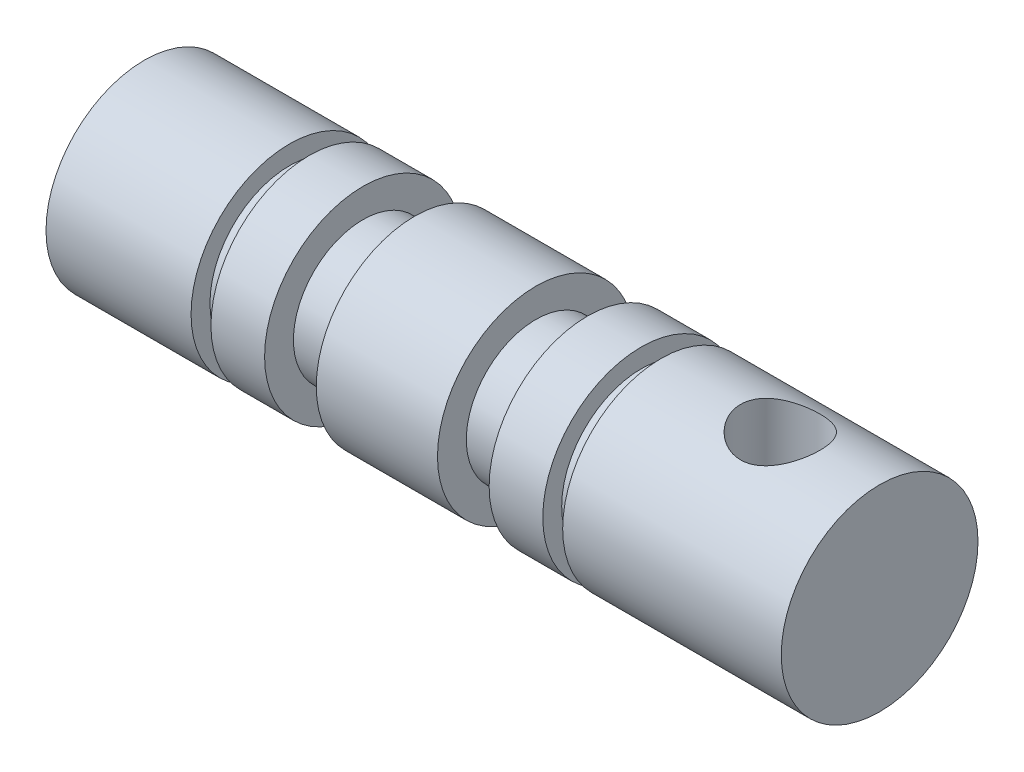
ISO-10303-21;
HEADER;
FILE_DESCRIPTION(('STEP AP214'),'2;1');
FILE_NAME('part.step','',(''),(''),'','','');
FILE_SCHEMA(('AUTOMOTIVE_DESIGN { 1 0 10303 214 1 1 1 1 }'));
ENDSEC;
DATA;
#1=APPLICATION_CONTEXT('core data for automotive mechanical design processes');
#2=APPLICATION_PROTOCOL_DEFINITION('international standard','automotive_design',2000,#1);
#3=PRODUCT_CONTEXT('',#1,'mechanical');
#4=PRODUCT('Part','Part','',(#3));
#5=PRODUCT_RELATED_PRODUCT_CATEGORY('part','',(#4));
#6=PRODUCT_DEFINITION_FORMATION('','',#4);
#7=PRODUCT_DEFINITION_CONTEXT('part definition',#1,'design');
#8=PRODUCT_DEFINITION('design','',#6,#7);
#9=PRODUCT_DEFINITION_SHAPE('','',#8);
#10=(LENGTH_UNIT() NAMED_UNIT(*) SI_UNIT(.MILLI.,.METRE.));
#11=(NAMED_UNIT(*) PLANE_ANGLE_UNIT() SI_UNIT($,.RADIAN.));
#12=(NAMED_UNIT(*) SI_UNIT($,.STERADIAN.) SOLID_ANGLE_UNIT());
#13=UNCERTAINTY_MEASURE_WITH_UNIT(LENGTH_MEASURE(1.E-05),#10,'distance_accuracy_value','');
#14=(GEOMETRIC_REPRESENTATION_CONTEXT(3) GLOBAL_UNCERTAINTY_ASSIGNED_CONTEXT((#13)) GLOBAL_UNIT_ASSIGNED_CONTEXT((#10,
#11,#12)) REPRESENTATION_CONTEXT('',''));
#15=CARTESIAN_POINT('',(0.,0.,0.));
#16=DIRECTION('',(0.,0.,1.));
#17=DIRECTION('',(1.,0.,0.));
#18=AXIS2_PLACEMENT_3D('',#15,#16,#17);
#19=CARTESIAN_POINT('',(37.,0.,0.));
#20=DIRECTION('',(-1.,0.,0.));
#21=DIRECTION('',(0.,0.,1.));
#22=AXIS2_PLACEMENT_3D('',#19,#20,#21);
#23=CYLINDRICAL_SURFACE('',#22,4.95);
#24=CARTESIAN_POINT('',(11.,0.,0.));
#25=DIRECTION('',(1.,0.,0.));
#26=DIRECTION('',(0.,0.,-1.));
#27=AXIS2_PLACEMENT_3D('',#24,#25,#26);
#28=CIRCLE('',#27,4.95);
#29=CARTESIAN_POINT('',(11.,0.,-4.95));
#30=VERTEX_POINT('',#29);
#31=EDGE_CURVE('E147',#30,#30,#28,.T.);
#32=ORIENTED_EDGE('',*,*,#31,.F.);
#33=EDGE_LOOP('',(#32));
#34=FACE_BOUND('',#33,.T.);
#35=CARTESIAN_POINT('',(8.3,0.,0.));
#36=DIRECTION('',(-1.,0.,0.));
#37=DIRECTION('',(0.,0.,1.));
#38=AXIS2_PLACEMENT_3D('',#35,#36,#37);
#39=CIRCLE('',#38,4.95);
#40=CARTESIAN_POINT('',(8.3,0.,4.95));
#41=VERTEX_POINT('',#40);
#42=EDGE_CURVE('E220',#41,#41,#39,.T.);
#43=ORIENTED_EDGE('',*,*,#42,.F.);
#44=EDGE_LOOP('',(#43));
#45=FACE_BOUND('',#44,.T.);
#46=ADVANCED_FACE('F41',(#34,#45),#23,.T.);
#47=CARTESIAN_POINT('',(13.6,0.,0.));
#48=DIRECTION('',(1.,0.,0.));
#49=DIRECTION('',(0.,0.,-1.));
#50=AXIS2_PLACEMENT_3D('',#47,#48,#49);
#51=CIRCLE('',#50,4.95);
#52=CARTESIAN_POINT('',(13.6,0.,-4.95));
#53=VERTEX_POINT('',#52);
#54=EDGE_CURVE('E150',#53,#53,#51,.T.);
#55=ORIENTED_EDGE('',*,*,#54,.T.);
#56=EDGE_LOOP('',(#55));
#57=FACE_BOUND('',#56,.T.);
#58=CARTESIAN_POINT('',(19.7,0.,0.));
#59=DIRECTION('',(1.,0.,0.));
#60=DIRECTION('',(0.,0.,-1.));
#61=AXIS2_PLACEMENT_3D('',#58,#59,#60);
#62=CIRCLE('',#61,4.95);
#63=CARTESIAN_POINT('',(19.7,0.,-4.95));
#64=VERTEX_POINT('',#63);
#65=EDGE_CURVE('E135',#64,#64,#62,.T.);
#66=ORIENTED_EDGE('',*,*,#65,.F.);
#67=EDGE_LOOP('',(#66));
#68=FACE_BOUND('',#67,.T.);
#69=ADVANCED_FACE('F170',(#57,#68),#23,.T.);
#70=CARTESIAN_POINT('',(13.6,0.,0.));
#71=DIRECTION('',(1.,0.,0.));
#72=DIRECTION('',(0.,0.,-1.));
#73=AXIS2_PLACEMENT_3D('',#70,#71,#72);
#74=PLANE('',#73);
#75=ORIENTED_EDGE('',*,*,#54,.F.);
#76=EDGE_LOOP('',(#75));
#77=FACE_BOUND('',#76,.T.);
#78=CARTESIAN_POINT('',(13.6,0.,0.));
#79=DIRECTION('',(1.,0.,0.));
#80=DIRECTION('',(0.,0.,-1.));
#81=AXIS2_PLACEMENT_3D('',#78,#79,#80);
#82=CIRCLE('',#81,3.5);
#83=CARTESIAN_POINT('',(13.6,0.,-3.5));
#84=VERTEX_POINT('',#83);
#85=EDGE_CURVE('E144',#84,#84,#82,.T.);
#86=ORIENTED_EDGE('',*,*,#85,.T.);
#87=EDGE_LOOP('',(#86));
#88=FACE_BOUND('',#87,.T.);
#89=ADVANCED_FACE('F176',(#77,#88),#74,.F.);
#90=CARTESIAN_POINT('',(11.,0.,0.));
#91=DIRECTION('',(1.,0.,0.));
#92=DIRECTION('',(0.,0.,-1.));
#93=AXIS2_PLACEMENT_3D('',#90,#91,#92);
#94=PLANE('',#93);
#95=ORIENTED_EDGE('',*,*,#31,.T.);
#96=EDGE_LOOP('',(#95));
#97=FACE_BOUND('',#96,.T.);
#98=CARTESIAN_POINT('',(11.,0.,0.));
#99=DIRECTION('',(1.,0.,0.));
#100=DIRECTION('',(0.,0.,-1.));
#101=AXIS2_PLACEMENT_3D('',#98,#99,#100);
#102=CIRCLE('',#101,3.5);
#103=CARTESIAN_POINT('',(11.,0.,-3.5));
#104=VERTEX_POINT('',#103);
#105=EDGE_CURVE('E141',#104,#104,#102,.T.);
#106=ORIENTED_EDGE('',*,*,#105,.F.);
#107=EDGE_LOOP('',(#106));
#108=FACE_BOUND('',#107,.T.);
#109=ADVANCED_FACE('F357',(#97,#108),#94,.T.);
#110=CARTESIAN_POINT('',(13.6,0.,0.));
#111=DIRECTION('',(-1.,0.,0.));
#112=DIRECTION('',(0.,0.,1.));
#113=AXIS2_PLACEMENT_3D('',#110,#111,#112);
#114=CYLINDRICAL_SURFACE('',#113,3.5);
#115=ORIENTED_EDGE('',*,*,#85,.F.);
#116=EDGE_LOOP('',(#115));
#117=FACE_BOUND('',#116,.T.);
#118=ORIENTED_EDGE('',*,*,#105,.T.);
#119=EDGE_LOOP('',(#118));
#120=FACE_BOUND('',#119,.T.);
#121=ADVANCED_FACE('F340',(#117,#120),#114,.T.);
#122=CARTESIAN_POINT('',(22.3,0.,0.));
#123=DIRECTION('',(1.,0.,0.));
#124=DIRECTION('',(0.,0.,-1.));
#125=AXIS2_PLACEMENT_3D('',#122,#123,#124);
#126=PLANE('',#125);
#127=CARTESIAN_POINT('',(22.3,0.,0.));
#128=DIRECTION('',(1.,0.,0.));
#129=DIRECTION('',(0.,0.,-1.));
#130=AXIS2_PLACEMENT_3D('',#127,#128,#129);
#131=CIRCLE('',#130,4.95);
#132=CARTESIAN_POINT('',(22.3,0.,-4.95));
#133=VERTEX_POINT('',#132);
#134=EDGE_CURVE('E138',#133,#133,#131,.T.);
#135=ORIENTED_EDGE('',*,*,#134,.F.);
#136=EDGE_LOOP('',(#135));
#137=FACE_BOUND('',#136,.T.);
#138=CARTESIAN_POINT('',(22.3,0.,0.));
#139=DIRECTION('',(1.,0.,0.));
#140=DIRECTION('',(0.,0.,-1.));
#141=AXIS2_PLACEMENT_3D('',#138,#139,#140);
#142=CIRCLE('',#141,3.5);
#143=CARTESIAN_POINT('',(22.3,0.,-3.5));
#144=VERTEX_POINT('',#143);
#145=EDGE_CURVE('E132',#144,#144,#142,.T.);
#146=ORIENTED_EDGE('',*,*,#145,.T.);
#147=EDGE_LOOP('',(#146));
#148=FACE_BOUND('',#147,.T.);
#149=ADVANCED_FACE('F329',(#137,#148),#126,.F.);
#150=CARTESIAN_POINT('',(19.7,0.,0.));
#151=DIRECTION('',(1.,0.,0.));
#152=DIRECTION('',(0.,0.,-1.));
#153=AXIS2_PLACEMENT_3D('',#150,#151,#152);
#154=PLANE('',#153);
#155=ORIENTED_EDGE('',*,*,#65,.T.);
#156=EDGE_LOOP('',(#155));
#157=FACE_BOUND('',#156,.T.);
#158=CARTESIAN_POINT('',(19.7,0.,0.));
#159=DIRECTION('',(1.,0.,0.));
#160=DIRECTION('',(0.,0.,-1.));
#161=AXIS2_PLACEMENT_3D('',#158,#159,#160);
#162=CIRCLE('',#161,3.5);
#163=CARTESIAN_POINT('',(19.7,0.,-3.5));
#164=VERTEX_POINT('',#163);
#165=EDGE_CURVE('E129',#164,#164,#162,.T.);
#166=ORIENTED_EDGE('',*,*,#165,.F.);
#167=EDGE_LOOP('',(#166));
#168=FACE_BOUND('',#167,.T.);
#169=ADVANCED_FACE('F203',(#157,#168),#154,.T.);
#170=CARTESIAN_POINT('',(22.3,0.,0.));
#171=DIRECTION('',(-1.,0.,0.));
#172=DIRECTION('',(0.,0.,1.));
#173=AXIS2_PLACEMENT_3D('',#170,#171,#172);
#174=CYLINDRICAL_SURFACE('',#173,3.5);
#175=ORIENTED_EDGE('',*,*,#145,.F.);
#176=EDGE_LOOP('',(#175));
#177=FACE_BOUND('',#176,.T.);
#178=ORIENTED_EDGE('',*,*,#165,.T.);
#179=EDGE_LOOP('',(#178));
#180=FACE_BOUND('',#179,.T.);
#181=ADVANCED_FACE('F194',(#177,#180),#174,.T.);
#182=CARTESIAN_POINT('',(25.,0.,0.));
#183=DIRECTION('',(-1.,0.,0.));
#184=DIRECTION('',(0.,0.,1.));
#185=AXIS2_PLACEMENT_3D('',#182,#183,#184);
#186=CIRCLE('',#185,4.95);
#187=CARTESIAN_POINT('',(25.,0.,4.95));
#188=VERTEX_POINT('',#187);
#189=EDGE_CURVE('E231',#188,#188,#186,.T.);
#190=ORIENTED_EDGE('',*,*,#189,.T.);
#191=EDGE_LOOP('',(#190));
#192=FACE_BOUND('',#191,.T.);
#193=ORIENTED_EDGE('',*,*,#134,.T.);
#194=EDGE_LOOP('',(#193));
#195=FACE_BOUND('',#194,.T.);
#196=ADVANCED_FACE('F43',(#192,#195),#23,.T.);
#197=CARTESIAN_POINT('',(7.3,0.,0.));
#198=DIRECTION('',(-1.,0.,0.));
#199=DIRECTION('',(0.,0.,1.));
#200=AXIS2_PLACEMENT_3D('',#197,#198,#199);
#201=PLANE('',#200);
#202=CARTESIAN_POINT('',(7.3,0.,0.));
#203=DIRECTION('',(-1.,0.,0.));
#204=DIRECTION('',(0.,0.,1.));
#205=AXIS2_PLACEMENT_3D('',#202,#203,#204);
#206=CIRCLE('',#205,4.95);
#207=CARTESIAN_POINT('',(7.3,0.,4.95));
#208=VERTEX_POINT('',#207);
#209=EDGE_CURVE('E87',#208,#208,#206,.T.);
#210=ORIENTED_EDGE('',*,*,#209,.F.);
#211=EDGE_LOOP('',(#210));
#212=FACE_BOUND('',#211,.T.);
#213=CARTESIAN_POINT('',(7.3,0.,0.));
#214=DIRECTION('',(-1.,0.,0.));
#215=DIRECTION('',(0.,0.,1.));
#216=AXIS2_PLACEMENT_3D('',#213,#214,#215);
#217=CIRCLE('',#216,4.);
#218=CARTESIAN_POINT('',(7.3,0.,4.));
#219=VERTEX_POINT('',#218);
#220=EDGE_CURVE('E223',#219,#219,#217,.T.);
#221=ORIENTED_EDGE('',*,*,#220,.T.);
#222=EDGE_LOOP('',(#221));
#223=FACE_BOUND('',#222,.T.);
#224=ADVANCED_FACE('F193',(#212,#223),#201,.F.);
#225=CARTESIAN_POINT('',(8.3,0.,0.));
#226=DIRECTION('',(-1.,0.,0.));
#227=DIRECTION('',(0.,0.,1.));
#228=AXIS2_PLACEMENT_3D('',#225,#226,#227);
#229=PLANE('',#228);
#230=ORIENTED_EDGE('',*,*,#42,.T.);
#231=EDGE_LOOP('',(#230));
#232=FACE_BOUND('',#231,.T.);
#233=CARTESIAN_POINT('',(8.3,0.,0.));
#234=DIRECTION('',(-1.,0.,0.));
#235=DIRECTION('',(0.,0.,1.));
#236=AXIS2_PLACEMENT_3D('',#233,#234,#235);
#237=CIRCLE('',#236,4.);
#238=CARTESIAN_POINT('',(8.3,0.,4.));
#239=VERTEX_POINT('',#238);
#240=EDGE_CURVE('E225',#239,#239,#237,.T.);
#241=ORIENTED_EDGE('',*,*,#240,.F.);
#242=EDGE_LOOP('',(#241));
#243=FACE_BOUND('',#242,.T.);
#244=ADVANCED_FACE('F200',(#232,#243),#229,.T.);
#245=CARTESIAN_POINT('',(7.3,0.,0.));
#246=DIRECTION('',(1.,0.,0.));
#247=DIRECTION('',(0.,0.,-1.));
#248=AXIS2_PLACEMENT_3D('',#245,#246,#247);
#249=CYLINDRICAL_SURFACE('',#248,4.);
#250=ORIENTED_EDGE('',*,*,#220,.F.);
#251=EDGE_LOOP('',(#250));
#252=FACE_BOUND('',#251,.T.);
#253=ORIENTED_EDGE('',*,*,#240,.T.);
#254=EDGE_LOOP('',(#253));
#255=FACE_BOUND('',#254,.T.);
#256=ADVANCED_FACE('F257',(#252,#255),#249,.T.);
#257=CARTESIAN_POINT('',(10.,0.,0.));
#258=DIRECTION('',(-1.,0.,0.));
#259=DIRECTION('',(0.,0.,1.));
#260=AXIS2_PLACEMENT_3D('',#257,#258,#259);
#261=PLANE('',#260);
#262=CARTESIAN_POINT('',(10.,0.,0.));
#263=DIRECTION('',(-1.,0.,0.));
#264=DIRECTION('',(0.,0.,1.));
#265=AXIS2_PLACEMENT_3D('',#262,#263,#264);
#266=CIRCLE('',#265,1.5);
#267=CARTESIAN_POINT('',(10.,0.,1.5));
#268=VERTEX_POINT('',#267);
#269=EDGE_CURVE('E126',#268,#268,#266,.T.);
#270=ORIENTED_EDGE('',*,*,#269,.T.);
#271=EDGE_LOOP('',(#270));
#272=FACE_BOUND('',#271,.T.);
#273=ADVANCED_FACE('F114',(#272),#261,.T.);
#274=CARTESIAN_POINT('',(3.3,0.,0.));
#275=DIRECTION('',(0.,1.,0.));
#276=DIRECTION('',(0.,0.,1.));
#277=AXIS2_PLACEMENT_3D('',#274,#275,#276);
#278=PLANE('',#277);
#279=CARTESIAN_POINT('',(3.3,0.,0.));
#280=DIRECTION('',(0.,1.,0.));
#281=DIRECTION('',(0.,0.,1.));
#282=AXIS2_PLACEMENT_3D('',#279,#280,#281);
#283=CIRCLE('',#282,1.6);
#284=CARTESIAN_POINT('',(2.743223563717,0.,1.5));
#285=VERTEX_POINT('',#284);
#286=CARTESIAN_POINT('',(3.856776436283,0.,1.5));
#287=VERTEX_POINT('',#286);
#288=EDGE_CURVE('E60',#285,#287,#283,.T.);
#289=ORIENTED_EDGE('',*,*,#288,.F.);
#290=DIRECTION('',(-1.,0.,0.));
#291=VECTOR('',#290,1.);
#292=CARTESIAN_POINT('',(10.,0.,1.5));
#293=LINE('',#292,#291);
#294=EDGE_CURVE('E74',#287,#285,#293,.T.);
#295=ORIENTED_EDGE('',*,*,#294,.F.);
#296=EDGE_LOOP('',(#289,#295));
#297=FACE_BOUND('',#296,.T.);
#298=ADVANCED_FACE('F75',(#297),#278,.F.);
#299=CARTESIAN_POINT('',(10.,0.,0.));
#300=DIRECTION('',(-1.,0.,0.));
#301=DIRECTION('',(0.,0.,1.));
#302=AXIS2_PLACEMENT_3D('',#299,#300,#301);
#303=CYLINDRICAL_SURFACE('',#302,1.5);
#304=CARTESIAN_POINT('',(2.743223563717,0.,1.5));
#305=CARTESIAN_POINT('',(2.74343305549233,-0.0400406506989848,1.50003689581477));
#306=CARTESIAN_POINT('',(2.73889316061447,-0.0796117870320099,1.49840154866974));
#307=CARTESIAN_POINT('',(2.72285021467995,-0.156251613102705,1.49231253008653));
#308=CARTESIAN_POINT('',(2.71150205489312,-0.193356151381784,1.48792145336253));
#309=CARTESIAN_POINT('',(2.67641377922563,-0.285772597585858,1.47364850090237));
#310=CARTESIAN_POINT('',(2.64929649479247,-0.339442502094465,1.46206424725791));
#311=CARTESIAN_POINT('',(2.58968248286407,-0.443103124694231,1.43407501082496));
#312=CARTESIAN_POINT('',(2.55711683425153,-0.493033017270301,1.4176058548068));
#313=CARTESIAN_POINT('',(2.4902852391322,-0.588891574228448,1.38050779178918));
#314=CARTESIAN_POINT('',(2.45605227582223,-0.634869164168335,1.35994524976092));
#315=CARTESIAN_POINT('',(2.38695516011965,-0.724183025218754,1.31455977806699));
#316=CARTESIAN_POINT('',(2.35209053936795,-0.767517222870795,1.28973356078901));
#317=CARTESIAN_POINT('',(2.24834322623198,-0.893465581013215,1.2089873917827));
#318=CARTESIAN_POINT('',(2.17992577640524,-0.9725318387014,1.14660254316257));
#319=CARTESIAN_POINT('',(2.06749766491797,-1.09984242619632,1.02273354964207));
#320=CARTESIAN_POINT('',(2.02183013802771,-1.15069622753619,0.965408801913105));
#321=CARTESIAN_POINT('',(1.93658590316892,-1.24470891321561,0.840701451392972));
#322=CARTESIAN_POINT('',(1.89700192562606,-1.28787699159181,0.77333104549858));
#323=CARTESIAN_POINT('',(1.83392848085342,-1.35628109272507,0.643960799477055));
#324=CARTESIAN_POINT('',(1.80880378643432,-1.38337936300443,0.583750361774985));
#325=CARTESIAN_POINT('',(1.76553178188983,-1.4299185685067,0.458053248421147));
#326=CARTESIAN_POINT('',(1.74737976546598,-1.4493646688771,0.39257016784509));
#327=CARTESIAN_POINT('',(1.71930975646841,-1.47939523119873,0.257326450701661));
#328=CARTESIAN_POINT('',(1.70945284105084,-1.48991396533459,0.187538076997913));
#329=CARTESIAN_POINT('',(1.69911649784795,-1.50094371499891,0.0464925763076652));
#330=CARTESIAN_POINT('',(1.69863188121701,-1.50146026809892,-0.024763716107998));
#331=CARTESIAN_POINT('',(1.70656617590471,-1.49299454618529,-0.15773657868371));
#332=CARTESIAN_POINT('',(1.71394823108093,-1.48511845910861,-0.219592423546615));
#333=CARTESIAN_POINT('',(1.73548417169899,-1.46209652873992,-0.34069662313972));
#334=CARTESIAN_POINT('',(1.74963894104922,-1.44694973654578,-0.399944636418798));
#335=CARTESIAN_POINT('',(1.78436498269606,-1.40967974581005,-0.516391426900949));
#336=CARTESIAN_POINT('',(1.80512330511915,-1.38735293676104,-0.573467934112342));
#337=CARTESIAN_POINT('',(1.85176557538089,-1.33696405306321,-0.682755352459664));
#338=CARTESIAN_POINT('',(1.87765221159281,-1.30889897003813,-0.734963690394219));
#339=CARTESIAN_POINT('',(1.94801718866405,-1.23215492747934,-0.860017096916105));
#340=CARTESIAN_POINT('',(1.99515833875834,-1.18035083181814,-0.929455419269533));
#341=CARTESIAN_POINT('',(2.09547539368455,-1.06840861810448,-1.05626386617199));
#342=CARTESIAN_POINT('',(2.14866636767601,-1.0082496031583,-1.11360279301278));
#343=CARTESIAN_POINT('',(2.25953684410487,-0.879599923548978,-1.217926520128));
#344=CARTESIAN_POINT('',(2.31729548080766,-0.810938084773342,-1.26461543106167));
#345=CARTESIAN_POINT('',(2.40358876676336,-0.702857410548888,-1.3257812716537));
#346=CARTESIAN_POINT('',(2.43228666472515,-0.665995083524647,-1.34468735279449));
#347=CARTESIAN_POINT('',(2.4889044518916,-0.590348523879942,-1.37957415045871));
#348=CARTESIAN_POINT('',(2.51682476391451,-0.551565368911397,-1.39555648420296));
#349=CARTESIAN_POINT('',(2.5701550147374,-0.472754212243339,-1.42415458770959));
#350=CARTESIAN_POINT('',(2.59561200518694,-0.43278686510067,-1.43684867580768));
#351=CARTESIAN_POINT('',(2.64319998055746,-0.350049519311362,-1.4592119584829));
#352=CARTESIAN_POINT('',(2.66533343126088,-0.307281632596669,-1.46888340142293));
#353=CARTESIAN_POINT('',(2.69803926466129,-0.230652095445099,-1.48252029573053));
#354=CARTESIAN_POINT('',(2.71011589593019,-0.197602617533523,-1.48732417134582));
#355=CARTESIAN_POINT('',(2.72917319272957,-0.129887932537238,-1.49474727336258));
#356=CARTESIAN_POINT('',(2.73617762083447,-0.095231079728732,-1.49737669512389));
#357=CARTESIAN_POINT('',(2.74214583625724,-0.0402251799588558,-1.49959822712595));
#358=CARTESIAN_POINT('',(2.74327113543149,-0.0201253517504161,-1.5000098761497));
#359=CARTESIAN_POINT('',(2.743223563717,0.,-1.5));
#360=B_SPLINE_CURVE_WITH_KNOTS('',3,(#304,#305,#306,#307,#308,#309,#310,#311,#312,#313,#314,
#315,#316,#317,#318,#319,#320,#321,#322,#323,#324,#325,#326,#327,#328,#329,#330,#331,#332,#333,
#334,#335,#336,#337,#338,#339,#340,#341,#342,#343,#344,#345,#346,#347,#348,#349,#350,#351,#352,
#353,#354,#355,#356,#357,#358,#359),.UNSPECIFIED.,.F.,.F.,(4,2,2,2,2,2,2,2,2,2,2,2,2,2,2,2,2,2,
2,2,2,2,2,2,2,2,2,4),(0.,0.119100457230796,0.235588943219049,0.418305960935853,
0.603538517644641,0.785982114290053,0.96856702543213,1.33176653653372,1.59852519002777,
1.86496255777631,2.07607788263128,2.28705046105211,2.49956317556399,2.71195823193469,
2.89946012174952,3.08698648915411,3.28038517412508,3.47388551244408,3.76812497767563,
4.06311409697746,4.36550469362875,4.51660376844251,4.66761901099857,4.81461267447055,
4.96149673657255,5.06771714004253,5.17343663810493,5.23374097753833),.UNSPECIFIED.);
#361=CARTESIAN_POINT('',(2.743223563717,0.,-1.5));
#362=VERTEX_POINT('',#361);
#363=EDGE_CURVE('E79',#285,#362,#360,.T.);
#364=ORIENTED_EDGE('',*,*,#363,.T.);
#365=DIRECTION('',(-1.,0.,0.));
#366=VECTOR('',#365,1.);
#367=CARTESIAN_POINT('',(10.,0.,-1.5));
#368=LINE('',#367,#366);
#369=CARTESIAN_POINT('',(3.856776436283,0.,-1.5));
#370=VERTEX_POINT('',#369);
#371=EDGE_CURVE('E67',#362,#370,#368,.F.);
#372=ORIENTED_EDGE('',*,*,#371,.T.);
#373=CARTESIAN_POINT('',(3.856776436283,0.,-1.5));
#374=CARTESIAN_POINT('',(3.85656694450767,-0.0400406506989848,-1.50003689581477));
#375=CARTESIAN_POINT('',(3.86110683938553,-0.0796117870320099,-1.49840154866974));
#376=CARTESIAN_POINT('',(3.87714978532005,-0.156251613102705,-1.49231253008653));
#377=CARTESIAN_POINT('',(3.88849794510688,-0.193356151381784,-1.48792145336253));
#378=CARTESIAN_POINT('',(3.92358622077437,-0.285772597585858,-1.47364850090237));
#379=CARTESIAN_POINT('',(3.95070350520753,-0.339442502094464,-1.46206424725791));
#380=CARTESIAN_POINT('',(4.01031751713592,-0.44310312469423,-1.43407501082496));
#381=CARTESIAN_POINT('',(4.04288316574847,-0.4930330172703,-1.4176058548068));
#382=CARTESIAN_POINT('',(4.1097147608678,-0.588891574228448,-1.38050779178918));
#383=CARTESIAN_POINT('',(4.14394772417777,-0.634869164168334,-1.35994524976092));
#384=CARTESIAN_POINT('',(4.21304483988034,-0.724183025218754,-1.31455977806699));
#385=CARTESIAN_POINT('',(4.24790946063205,-0.767517222870795,-1.28973356078901));
#386=CARTESIAN_POINT('',(4.35165677376802,-0.893465581013215,-1.20898739178269));
#387=CARTESIAN_POINT('',(4.42007422359476,-0.972531838701401,-1.14660254316257));
#388=CARTESIAN_POINT('',(4.53250233508203,-1.09984242619632,-1.02273354964207));
#389=CARTESIAN_POINT('',(4.57816986197229,-1.15069622753619,-0.965408801913104));
#390=CARTESIAN_POINT('',(4.66341409683108,-1.24470891321561,-0.840701451392971));
#391=CARTESIAN_POINT('',(4.70299807437394,-1.28787699159181,-0.773331045498579));
#392=CARTESIAN_POINT('',(4.76607151914658,-1.35628109272507,-0.643960799477053));
#393=CARTESIAN_POINT('',(4.79119621356568,-1.38337936300443,-0.583750361774984));
#394=CARTESIAN_POINT('',(4.83446821811017,-1.4299185685067,-0.458053248421145));
#395=CARTESIAN_POINT('',(4.85262023453402,-1.4493646688771,-0.392570167845089));
#396=CARTESIAN_POINT('',(4.88069024353159,-1.47939523119873,-0.25732645070166));
#397=CARTESIAN_POINT('',(4.89054715894916,-1.48991396533459,-0.187538076997912));
#398=CARTESIAN_POINT('',(4.90088350215205,-1.50094371499891,-0.0464925763076638));
#399=CARTESIAN_POINT('',(4.90136811878299,-1.50146026809892,0.0247637161079993));
#400=CARTESIAN_POINT('',(4.89343382409529,-1.49299454618529,0.157736578683711));
#401=CARTESIAN_POINT('',(4.88605176891907,-1.48511845910861,0.219592423546616));
#402=CARTESIAN_POINT('',(4.86451582830101,-1.46209652873992,0.340696623139721));
#403=CARTESIAN_POINT('',(4.85036105895078,-1.44694973654578,0.399944636418799));
#404=CARTESIAN_POINT('',(4.81563501730394,-1.40967974581005,0.51639142690095));
#405=CARTESIAN_POINT('',(4.79487669488085,-1.38735293676104,0.573467934112343));
#406=CARTESIAN_POINT('',(4.74823442461911,-1.33696405306321,0.682755352459665));
#407=CARTESIAN_POINT('',(4.72234778840719,-1.30889897003813,0.73496369039422));
#408=CARTESIAN_POINT('',(4.65198281133595,-1.23215492747934,0.860017096916105));
#409=CARTESIAN_POINT('',(4.60484166124166,-1.18035083181814,0.929455419269534));
#410=CARTESIAN_POINT('',(4.50452460631545,-1.06840861810448,1.05626386617199));
#411=CARTESIAN_POINT('',(4.45133363232399,-1.0082496031583,1.11360279301278));
#412=CARTESIAN_POINT('',(4.34046315589512,-0.879599923548977,1.217926520128));
#413=CARTESIAN_POINT('',(4.28270451919234,-0.810938084773341,1.26461543106167));
#414=CARTESIAN_POINT('',(4.19641123323664,-0.702857410548887,1.3257812716537));
#415=CARTESIAN_POINT('',(4.16771333527485,-0.665995083524646,1.34468735279449));
#416=CARTESIAN_POINT('',(4.1110955481084,-0.590348523879941,1.37957415045871));
#417=CARTESIAN_POINT('',(4.08317523608548,-0.551565368911396,1.39555648420296));
#418=CARTESIAN_POINT('',(4.0298449852626,-0.472754212243338,1.42415458770959));
#419=CARTESIAN_POINT('',(4.00438799481306,-0.432786865100669,1.43684867580768));
#420=CARTESIAN_POINT('',(3.95680001944254,-0.350049519311361,1.4592119584829));
#421=CARTESIAN_POINT('',(3.93466656873912,-0.307281632596668,1.46888340142294));
#422=CARTESIAN_POINT('',(3.90196073533871,-0.230652095445097,1.48252029573053));
#423=CARTESIAN_POINT('',(3.88988410406981,-0.197602617533522,1.48732417134582));
#424=CARTESIAN_POINT('',(3.87082680727043,-0.129887932537237,1.49474727336258));
#425=CARTESIAN_POINT('',(3.86382237916553,-0.0952310797287308,1.49737669512389));
#426=CARTESIAN_POINT('',(3.85785416374276,-0.0402251799588549,1.49959822712595));
#427=CARTESIAN_POINT('',(3.85672886456851,-0.0201253517504157,1.5000098761497));
#428=CARTESIAN_POINT('',(3.856776436283,0.,1.5));
#429=B_SPLINE_CURVE_WITH_KNOTS('',3,(#373,#374,#375,#376,#377,#378,#379,#380,#381,#382,#383,
#384,#385,#386,#387,#388,#389,#390,#391,#392,#393,#394,#395,#396,#397,#398,#399,#400,#401,#402,
#403,#404,#405,#406,#407,#408,#409,#410,#411,#412,#413,#414,#415,#416,#417,#418,#419,#420,#421,
#422,#423,#424,#425,#426,#427,#428),.UNSPECIFIED.,.F.,.F.,(4,2,2,2,2,2,2,2,2,2,2,2,2,2,2,2,2,2,
2,2,2,2,2,2,2,2,2,4),(0.,0.119100457230796,0.235588943219049,0.418305960935851,0.60353851764464,
0.785982114290053,0.96856702543213,1.33176653653372,1.59852519002777,1.86496255777631,
2.07607788263128,2.28705046105211,2.49956317556399,2.71195823193469,2.89946012174952,
3.08698648915411,3.28038517412508,3.47388551244408,3.76812497767563,4.06311409697746,
4.36550469362875,4.51660376844252,4.66761901099857,4.81461267447055,4.96149673657255,
5.06771714004253,5.17343663810493,5.23374097753833),.UNSPECIFIED.);
#430=EDGE_CURVE('E85',#370,#287,#429,.T.);
#431=ORIENTED_EDGE('',*,*,#430,.T.);
#432=ORIENTED_EDGE('',*,*,#294,.T.);
#433=EDGE_LOOP('',(#364,#372,#431,#432));
#434=FACE_BOUND('',#433,.T.);
#435=ORIENTED_EDGE('',*,*,#269,.F.);
#436=EDGE_LOOP('',(#435));
#437=FACE_BOUND('',#436,.T.);
#438=CARTESIAN_POINT('',(0.,0.,0.));
#439=DIRECTION('',(-1.,0.,0.));
#440=DIRECTION('',(0.,0.,1.));
#441=AXIS2_PLACEMENT_3D('',#438,#439,#440);
#442=CIRCLE('',#441,1.5);
#443=CARTESIAN_POINT('',(0.,0.,1.5));
#444=VERTEX_POINT('',#443);
#445=EDGE_CURVE('E124',#444,#444,#442,.T.);
#446=ORIENTED_EDGE('',*,*,#445,.T.);
#447=EDGE_LOOP('',(#446));
#448=FACE_BOUND('',#447,.T.);
#449=ADVANCED_FACE('F89',(#434,#437,#448),#303,.F.);
#450=EDGE_CURVE('E86',#370,#362,#283,.T.);
#451=ORIENTED_EDGE('',*,*,#450,.F.);
#452=ORIENTED_EDGE('',*,*,#371,.F.);
#453=EDGE_LOOP('',(#451,#452));
#454=FACE_BOUND('',#453,.T.);
#455=ADVANCED_FACE('F112',(#454),#278,.F.);
#456=CARTESIAN_POINT('',(0.,0.,0.));
#457=DIRECTION('',(1.,0.,0.));
#458=DIRECTION('',(0.,0.,-1.));
#459=AXIS2_PLACEMENT_3D('',#456,#457,#458);
#460=PLANE('',#459);
#461=ORIENTED_EDGE('',*,*,#445,.F.);
#462=EDGE_LOOP('',(#461));
#463=FACE_BOUND('',#462,.T.);
#464=CARTESIAN_POINT('',(0.,0.,0.));
#465=DIRECTION('',(1.,0.,0.));
#466=DIRECTION('',(0.,0.,-1.));
#467=AXIS2_PLACEMENT_3D('',#464,#465,#466);
#468=CIRCLE('',#467,4.95);
#469=CARTESIAN_POINT('',(0.,0.,-4.95));
#470=VERTEX_POINT('',#469);
#471=EDGE_CURVE('E153',#470,#470,#468,.T.);
#472=ORIENTED_EDGE('',*,*,#471,.F.);
#473=EDGE_LOOP('',(#472));
#474=FACE_BOUND('',#473,.T.);
#475=ADVANCED_FACE('F111',(#463,#474),#460,.F.);
#476=CARTESIAN_POINT('',(3.3,-4.95,0.));
#477=DIRECTION('',(0.,1.,0.));
#478=DIRECTION('',(0.,0.,1.));
#479=AXIS2_PLACEMENT_3D('',#476,#477,#478);
#480=CYLINDRICAL_SURFACE('',#479,1.6);
#481=ORIENTED_EDGE('',*,*,#450,.T.);
#482=ORIENTED_EDGE('',*,*,#363,.F.);
#483=ORIENTED_EDGE('',*,*,#288,.T.);
#484=ORIENTED_EDGE('',*,*,#430,.F.);
#485=EDGE_LOOP('',(#481,#482,#483,#484));
#486=FACE_BOUND('',#485,.T.);
#487=CARTESIAN_POINT('',(1.7,-4.95,0.));
#488=CARTESIAN_POINT('',(1.70000009423404,-4.94999988899515,0.0874492997862339));
#489=CARTESIAN_POINT('',(1.7071928963931,-4.94766099256415,0.17490032005276));
#490=CARTESIAN_POINT('',(1.73569225396372,-4.93856043807193,0.347235511990942));
#491=CARTESIAN_POINT('',(1.75700111786511,-4.93179805661219,0.432119261445816));
#492=CARTESIAN_POINT('',(1.81293220809526,-4.91458727169007,0.596810261249954));
#493=CARTESIAN_POINT('',(1.84753298407877,-4.90414480933435,0.676625450591961));
#494=CARTESIAN_POINT('',(1.92897154749387,-4.88064576902408,0.829320544859114));
#495=CARTESIAN_POINT('',(1.97581151625665,-4.86758872518254,0.902199210359787));
#496=CARTESIAN_POINT('',(2.08201419665196,-4.83976148836847,1.04134301716922));
#497=CARTESIAN_POINT('',(2.14170616725441,-4.82495206240648,1.1073489648197));
#498=CARTESIAN_POINT('',(2.27121789429781,-4.79551056487835,1.22860883453416));
#499=CARTESIAN_POINT('',(2.34103970192811,-4.78087852988387,1.28386057366138));
#500=CARTESIAN_POINT('',(2.49111836581774,-4.75302213549941,1.38348649367782));
#501=CARTESIAN_POINT('',(2.57160436834912,-4.73984589195174,1.42753022453775));
#502=CARTESIAN_POINT('',(2.73933582022022,-4.71698630495844,1.50134751377686));
#503=CARTESIAN_POINT('',(2.8265793384991,-4.70730196808934,1.5311251315609));
#504=CARTESIAN_POINT('',(3.00241268705139,-4.69293445460948,1.57460431667812));
#505=CARTESIAN_POINT('',(3.09087040070829,-4.68810134915352,1.58878920592376));
#506=CARTESIAN_POINT('',(3.26903210102533,-4.6835392117705,1.6021907680239));
#507=CARTESIAN_POINT('',(3.35873572204131,-4.68380871270739,1.60141174340361));
#508=CARTESIAN_POINT('',(3.53278267341922,-4.6892894793962,1.58528420891852));
#509=CARTESIAN_POINT('',(3.61719148123893,-4.69428956228681,1.57055828758517));
#510=CARTESIAN_POINT('',(3.78226929070075,-4.7083237734861,1.52796756750486));
#511=CARTESIAN_POINT('',(3.86293786834401,-4.71735835792454,1.50010128312424));
#512=CARTESIAN_POINT('',(4.01969349818877,-4.73859963307389,1.43159763513536));
#513=CARTESIAN_POINT('',(4.09569098233748,-4.75085298291483,1.39077040600485));
#514=CARTESIAN_POINT('',(4.23995674576105,-4.77713069841099,1.29763562104292));
#515=CARTESIAN_POINT('',(4.30822289351733,-4.79115555022336,1.24532491085544));
#516=CARTESIAN_POINT('',(4.43859725716059,-4.82023493237276,1.12768596298061));
#517=CARTESIAN_POINT('',(4.50024110995199,-4.83530627758293,1.06184625314865));
#518=CARTESIAN_POINT('',(4.61172977422158,-4.8641781273735,0.920577081336188));
#519=CARTESIAN_POINT('',(4.66157358520684,-4.87797852413313,0.845146807031062));
#520=CARTESIAN_POINT('',(4.74839168219556,-4.90291635169877,0.685897206294578));
#521=CARTESIAN_POINT('',(4.78524829068526,-4.91402916009717,0.602009607059997));
#522=CARTESIAN_POINT('',(4.84418575015886,-4.93216150504601,0.42878105860646));
#523=CARTESIAN_POINT('',(4.86627141475683,-4.93918237499767,0.339441896331597));
#524=CARTESIAN_POINT('',(4.89423299553431,-4.94812199788817,0.161782542772179));
#525=CARTESIAN_POINT('',(4.90073694791544,-4.95023831237628,0.0735709993509011));
#526=CARTESIAN_POINT('',(4.89913050453356,-4.94971884478392,-0.1026963765522));
#527=CARTESIAN_POINT('',(4.89102241054847,-4.94708381116451,-0.190752231371869));
#528=CARTESIAN_POINT('',(4.86092267153919,-4.93748787299665,-0.361739935932434));
#529=CARTESIAN_POINT('',(4.83931070916618,-4.93064534969521,-0.444745912656705));
#530=CARTESIAN_POINT('',(4.78328579253274,-4.91344372008337,-0.605925486323164));
#531=CARTESIAN_POINT('',(4.74887122782295,-4.90308417137793,-0.684098473876546));
#532=CARTESIAN_POINT('',(4.66724491678145,-4.8795795445054,-0.835603658852575));
#533=CARTESIAN_POINT('',(4.61973035830842,-4.86637040428016,-0.908762492735307));
#534=CARTESIAN_POINT('',(4.51361221088809,-4.83867078963813,-1.04627597991562));
#535=CARTESIAN_POINT('',(4.45500541844293,-4.82417994570388,-1.11062808050617));
#536=CARTESIAN_POINT('',(4.32541188034777,-4.79477079198145,-1.23154908365162));
#537=CARTESIAN_POINT('',(4.25400429798871,-4.77986054858192,-1.28766998312078));
#538=CARTESIAN_POINT('',(4.10246261321873,-4.75193760343371,-1.38718029116517));
#539=CARTESIAN_POINT('',(4.02232855080213,-4.73892489298908,-1.43056975808644));
#540=CARTESIAN_POINT('',(3.85567931630188,-4.71640714612487,-1.50314733605064));
#541=CARTESIAN_POINT('',(3.76918426529081,-4.70689157565403,-1.53237818156188));
#542=CARTESIAN_POINT('',(3.59212485943835,-4.69255476807122,-1.57574157526643));
#543=CARTESIAN_POINT('',(3.50156221153037,-4.6877315807427,-1.58988039614258));
#544=CARTESIAN_POINT('',(3.32364847972451,-4.68353839672044,-1.60218780031849));
#545=CARTESIAN_POINT('',(3.2363538848573,-4.68391596155922,-1.60109564416246));
#546=CARTESIAN_POINT('',(3.06325946456068,-4.68946294574716,-1.58477438775107));
#547=CARTESIAN_POINT('',(2.97745956021011,-4.69463211130897,-1.5695460362199));
#548=CARTESIAN_POINT('',(2.81121374368301,-4.70899747890114,-1.52589431470703));
#549=CARTESIAN_POINT('',(2.73070215907393,-4.71812466708559,-1.49769659503526));
#550=CARTESIAN_POINT('',(2.57548961426931,-4.73935595557469,-1.42908666893327));
#551=CARTESIAN_POINT('',(2.50078989727008,-4.75146069050408,-1.38867185817065));
#552=CARTESIAN_POINT('',(2.35596782094095,-4.77790889742563,-1.29481814848352));
#553=CARTESIAN_POINT('',(2.28616350541291,-4.79232436451648,-1.2409088643399));
#554=CARTESIAN_POINT('',(2.15635294173149,-4.82145404338514,-1.12240760215851));
#555=CARTESIAN_POINT('',(2.09634939779207,-4.8361683363596,-1.05781268561957));
#556=CARTESIAN_POINT('',(1.98568500601157,-4.86487010358637,-0.916993373875944));
#557=CARTESIAN_POINT('',(1.93543565887828,-4.8788126824303,-0.840435364396552));
#558=CARTESIAN_POINT('',(1.84858077044439,-4.90381290981091,-0.67951086284844));
#559=CARTESIAN_POINT('',(1.81197080231358,-4.91487149403376,-0.595146915411115));
#560=CARTESIAN_POINT('',(1.75552865090986,-4.93226293365768,-0.426604127088887));
#561=CARTESIAN_POINT('',(1.73476871446398,-4.93885401533872,-0.342762455439772));
#562=CARTESIAN_POINT('',(1.70700597848167,-4.94772209026629,-0.172614020316676));
#563=CARTESIAN_POINT('',(1.69999990699597,-4.95000010955593,-0.0863078480880893));
#564=CARTESIAN_POINT('',(1.7,-4.95,0.));
#565=B_SPLINE_CURVE_WITH_KNOTS('',3,(#487,#488,#489,#490,#491,#492,#493,#494,#495,#496,#497,
#498,#499,#500,#501,#502,#503,#504,#505,#506,#507,#508,#509,#510,#511,#512,#513,#514,#515,#516,
#517,#518,#519,#520,#521,#522,#523,#524,#525,#526,#527,#528,#529,#530,#531,#532,#533,#534,#535,
#536,#537,#538,#539,#540,#541,#542,#543,#544,#545,#546,#547,#548,#549,#550,#551,#552,#553,#554,
#555,#556,#557,#558,#559,#560,#561,#562,#563,#564),.UNSPECIFIED.,.T.,.F.,(4,2,2,2,2,2,2,2,2,2,2,
2,2,2,2,2,2,2,2,2,2,2,2,2,2,2,2,2,2,2,2,2,2,2,2,2,2,2,4),(0.,0.262030472542237,0.52410380718502,
0.785755975432299,1.04745480850507,1.31688986572874,1.58637955716539,1.86307691482642,
2.13969549176393,2.4074743648744,2.67517624555395,2.93146461153105,3.18778196011248,
3.44804228570729,3.70837419092721,3.98143635738702,4.25452166774771,4.53002136679588,
4.80543124109998,5.06953855040415,5.33360425956389,5.59056018333228,5.8475484407228,
6.11106342367077,6.37465462763996,6.64946796558942,6.92428004409546,7.19825741682423,
7.47212087222381,7.73274017523739,7.99334567532615,8.24957916434207,8.50586731353195,
8.77277790582501,9.03976201972793,9.31630669479788,9.59276153549677,9.85143333992225,
10.1100436006551),.UNSPECIFIED.);
#566=CARTESIAN_POINT('',(1.7,-4.95,0.));
#567=VERTEX_POINT('',#566);
#568=EDGE_CURVE('E118',#567,#567,#565,.T.);
#569=ORIENTED_EDGE('',*,*,#568,.F.);
#570=EDGE_LOOP('',(#569));
#571=FACE_BOUND('',#570,.T.);
#572=ADVANCED_FACE('F83',(#486,#571),#480,.F.);
#573=ORIENTED_EDGE('',*,*,#209,.T.);
#574=EDGE_LOOP('',(#573));
#575=FACE_BOUND('',#574,.T.);
#576=ORIENTED_EDGE('',*,*,#568,.T.);
#577=EDGE_LOOP('',(#576));
#578=FACE_BOUND('',#577,.T.);
#579=ORIENTED_EDGE('',*,*,#471,.T.);
#580=EDGE_LOOP('',(#579));
#581=FACE_BOUND('',#580,.T.);
#582=ADVANCED_FACE('F110',(#575,#578,#581),#23,.T.);
#583=CARTESIAN_POINT('',(26.,0.,0.));
#584=DIRECTION('',(-1.,0.,0.));
#585=DIRECTION('',(0.,0.,1.));
#586=AXIS2_PLACEMENT_3D('',#583,#584,#585);
#587=PLANE('',#586);
#588=CARTESIAN_POINT('',(26.,0.,0.));
#589=DIRECTION('',(-1.,0.,0.));
#590=DIRECTION('',(0.,0.,1.));
#591=AXIS2_PLACEMENT_3D('',#588,#589,#590);
#592=CIRCLE('',#591,4.);
#593=CARTESIAN_POINT('',(26.,0.,4.));
#594=VERTEX_POINT('',#593);
#595=EDGE_CURVE('E233',#594,#594,#592,.T.);
#596=ORIENTED_EDGE('',*,*,#595,.F.);
#597=EDGE_LOOP('',(#596));
#598=FACE_BOUND('',#597,.T.);
#599=CARTESIAN_POINT('',(26.,0.,0.));
#600=DIRECTION('',(-1.,0.,0.));
#601=DIRECTION('',(0.,0.,1.));
#602=AXIS2_PLACEMENT_3D('',#599,#600,#601);
#603=CIRCLE('',#602,4.95);
#604=CARTESIAN_POINT('',(26.,0.,4.95));
#605=VERTEX_POINT('',#604);
#606=EDGE_CURVE('E228',#605,#605,#603,.T.);
#607=ORIENTED_EDGE('',*,*,#606,.T.);
#608=EDGE_LOOP('',(#607));
#609=FACE_BOUND('',#608,.T.);
#610=ADVANCED_FACE('F208',(#598,#609),#587,.T.);
#611=CARTESIAN_POINT('',(25.,0.,0.));
#612=DIRECTION('',(-1.,0.,0.));
#613=DIRECTION('',(0.,0.,1.));
#614=AXIS2_PLACEMENT_3D('',#611,#612,#613);
#615=PLANE('',#614);
#616=CARTESIAN_POINT('',(25.,0.,0.));
#617=DIRECTION('',(-1.,0.,0.));
#618=DIRECTION('',(0.,0.,1.));
#619=AXIS2_PLACEMENT_3D('',#616,#617,#618);
#620=CIRCLE('',#619,4.);
#621=CARTESIAN_POINT('',(25.,0.,4.));
#622=VERTEX_POINT('',#621);
#623=EDGE_CURVE('E236',#622,#622,#620,.T.);
#624=ORIENTED_EDGE('',*,*,#623,.T.);
#625=EDGE_LOOP('',(#624));
#626=FACE_BOUND('',#625,.T.);
#627=ORIENTED_EDGE('',*,*,#189,.F.);
#628=EDGE_LOOP('',(#627));
#629=FACE_BOUND('',#628,.T.);
#630=ADVANCED_FACE('F213',(#626,#629),#615,.F.);
#631=CARTESIAN_POINT('',(26.,0.,0.));
#632=DIRECTION('',(-1.,0.,0.));
#633=DIRECTION('',(0.,0.,1.));
#634=AXIS2_PLACEMENT_3D('',#631,#632,#633);
#635=CYLINDRICAL_SURFACE('',#634,4.);
#636=ORIENTED_EDGE('',*,*,#595,.T.);
#637=EDGE_LOOP('',(#636));
#638=FACE_BOUND('',#637,.T.);
#639=ORIENTED_EDGE('',*,*,#623,.F.);
#640=EDGE_LOOP('',(#639));
#641=FACE_BOUND('',#640,.T.);
#642=ADVANCED_FACE('F189',(#638,#641),#635,.T.);
#643=CARTESIAN_POINT('',(37.,0.,0.));
#644=DIRECTION('',(1.,0.,0.));
#645=DIRECTION('',(0.,0.,-1.));
#646=AXIS2_PLACEMENT_3D('',#643,#644,#645);
#647=PLANE('',#646);
#648=CARTESIAN_POINT('',(37.,0.,0.));
#649=DIRECTION('',(1.,0.,0.));
#650=DIRECTION('',(0.,0.,-1.));
#651=AXIS2_PLACEMENT_3D('',#648,#649,#650);
#652=CIRCLE('',#651,4.95);
#653=CARTESIAN_POINT('',(37.,0.,-4.95));
#654=VERTEX_POINT('',#653);
#655=EDGE_CURVE('E80',#654,#654,#652,.T.);
#656=ORIENTED_EDGE('',*,*,#655,.T.);
#657=EDGE_LOOP('',(#656));
#658=FACE_BOUND('',#657,.T.);
#659=ADVANCED_FACE('F182',(#658),#647,.T.);
#660=CARTESIAN_POINT('',(30.,-4.95,0.));
#661=CARTESIAN_POINT('',(30.0000103189786,-4.94999233604355,0.107406627602987));
#662=CARTESIAN_POINT('',(30.0087037074654,-4.94646329977569,0.214995637651015));
#663=CARTESIAN_POINT('',(30.0431744688571,-4.93268980192275,0.427137002221819));
#664=CARTESIAN_POINT('',(30.0689978503209,-4.92242725596453,0.531680385091014));
#665=CARTESIAN_POINT('',(30.1366317725825,-4.89629193378388,0.734318670332697));
#666=CARTESIAN_POINT('',(30.1783895284861,-4.88043769384045,0.832433623679295));
#667=CARTESIAN_POINT('',(30.2764953866712,-4.84467623668995,1.0201750853979));
#668=CARTESIAN_POINT('',(30.3328385796194,-4.82477038370209,1.10980443611427));
#669=CARTESIAN_POINT('',(30.4613652690259,-4.78184830349163,1.28245225731779));
#670=CARTESIAN_POINT('',(30.5341328066665,-4.75873424004195,1.36501143779442));
#671=CARTESIAN_POINT('',(30.6922094048133,-4.71244190301418,1.51714443579326));
#672=CARTESIAN_POINT('',(30.7775246730812,-4.6892636032575,1.58671178695308));
#673=CARTESIAN_POINT('',(30.9629990244304,-4.64428976358368,1.7140141041459));
#674=CARTESIAN_POINT('',(31.0636576904566,-4.62260552610761,1.77106458461637));
#675=CARTESIAN_POINT('',(31.2741486633164,-4.58461379836026,1.86721966727296));
#676=CARTESIAN_POINT('',(31.3839764940183,-4.5683037035966,1.90633296603928));
#677=CARTESIAN_POINT('',(31.6044080550726,-4.54395934215866,1.96363645335955));
#678=CARTESIAN_POINT('',(31.714743218362,-4.53557860081562,1.98270710512994));
#679=CARTESIAN_POINT('',(31.9373413551166,-4.52703940492109,2.00213352782658));
#680=CARTESIAN_POINT('',(32.0496033250992,-4.52687679300191,2.00249876140637));
#681=CARTESIAN_POINT('',(32.2643350280125,-4.53449722194656,1.98517024207717));
#682=CARTESIAN_POINT('',(32.3669324632542,-4.54171484609883,1.96876159798038));
#683=CARTESIAN_POINT('',(32.5677696215306,-4.56233194707518,1.92049694501179));
#684=CARTESIAN_POINT('',(32.666008563524,-4.57573252701842,1.88863817958698));
#685=CARTESIAN_POINT('',(32.8577376378542,-4.60750209177446,1.80976718118729));
#686=CARTESIAN_POINT('',(32.9510879941735,-4.62596787047355,1.76245589449368));
#687=CARTESIAN_POINT('',(33.1288725996055,-4.66576157352171,1.65423313656141));
#688=CARTESIAN_POINT('',(33.2133034399515,-4.68709058509069,1.59331649326848));
#689=CARTESIAN_POINT('',(33.377872932833,-4.73225959147319,1.45395632390442));
#690=CARTESIAN_POINT('',(33.4571453160678,-4.75616482724401,1.37450824123685));
#691=CARTESIAN_POINT('',(33.601521902517,-4.80236252538582,1.20319516424393));
#692=CARTESIAN_POINT('',(33.6666231688391,-4.82465465281044,1.1113276024272));
#693=CARTESIAN_POINT('',(33.7819778140353,-4.86569349716381,0.915284411749027));
#694=CARTESIAN_POINT('',(33.8318989769935,-4.88435804387792,0.810894843129023));
#695=CARTESIAN_POINT('',(33.913172132141,-4.9154153018475,0.594253691733624));
#696=CARTESIAN_POINT('',(33.9445337555592,-4.92781126561487,0.482006220593889));
#697=CARTESIAN_POINT('',(33.9860310314579,-4.94433834001142,0.260091551081214));
#698=CARTESIAN_POINT('',(33.9973304574328,-4.94892192611177,0.150675575210627));
#699=CARTESIAN_POINT('',(34.0018268895317,-4.95073763811937,-0.0685749154200751));
#700=CARTESIAN_POINT('',(33.9950287061841,-4.94797171760049,-0.178409311210164));
#701=CARTESIAN_POINT('',(33.9643733477035,-4.93569477716607,-0.390062194936813));
#702=CARTESIAN_POINT('',(33.9413160264162,-4.92650018344865,-0.492016915643238));
#703=CARTESIAN_POINT('',(33.8798911776559,-4.90262106405841,-0.690512367201782));
#704=CARTESIAN_POINT('',(33.8415216903402,-4.8879358356406,-0.787052403210035));
#705=CARTESIAN_POINT('',(33.7493082540779,-4.85393555735365,-0.975318321652429));
#706=CARTESIAN_POINT('',(33.6950250341367,-4.83449210810239,-1.06680512022576));
#707=CARTESIAN_POINT('',(33.5730111725909,-4.79307563518119,-1.23969425308367));
#708=CARTESIAN_POINT('',(33.505275082537,-4.77110158813215,-1.32109247970542));
#709=CARTESIAN_POINT('',(33.3529322830141,-4.72517809149261,-1.47724645137449));
#710=CARTESIAN_POINT('',(33.2674967051096,-4.7011952586594,-1.55118586323042));
#711=CARTESIAN_POINT('',(33.0850157467851,-4.65531663651776,-1.68388525870917));
#712=CARTESIAN_POINT('',(32.9879682933784,-4.63342122111869,-1.74264252603696));
#713=CARTESIAN_POINT('',(32.7834304487867,-4.59413819913653,-1.84374113893522));
#714=CARTESIAN_POINT('',(32.6758392092091,-4.57680146378345,-1.88589964225983));
#715=CARTESIAN_POINT('',(32.4541706481163,-4.54936543186463,-1.95116665317172));
#716=CARTESIAN_POINT('',(32.3400983168982,-4.53926064623622,-1.97428961077922));
#717=CARTESIAN_POINT('',(32.1177027919925,-4.52823691905418,-1.99943528198434));
#718=CARTESIAN_POINT('',(32.0095699212333,-4.52669976482684,-2.00287852648207));
#719=CARTESIAN_POINT('',(31.7943411168077,-4.53136023054596,-1.99231222242793));
#720=CARTESIAN_POINT('',(31.6872450472377,-4.53755682253368,-1.97830499336907));
#721=CARTESIAN_POINT('',(31.4816535697205,-4.55643643661306,-1.93440366454191));
#722=CARTESIAN_POINT('',(31.3829855966475,-4.56884192202449,-1.90518733818164));
#723=CARTESIAN_POINT('',(31.1919163222163,-4.59854072165852,-1.83233797449496));
#724=CARTESIAN_POINT('',(31.0995167676954,-4.61583539148203,-1.78870093823907));
#725=CARTESIAN_POINT('',(30.9177680149639,-4.65460868430972,-1.68532773587207));
#726=CARTESIAN_POINT('',(30.8289063046423,-4.67627175542193,-1.62480482759409));
#727=CARTESIAN_POINT('',(30.6621547658869,-4.72079026121782,-1.49051625578168));
#728=CARTESIAN_POINT('',(30.5842683798055,-4.74364606692994,-1.41674645385557));
#729=CARTESIAN_POINT('',(30.436342504016,-4.78980756252758,-1.25220294034441));
#730=CARTESIAN_POINT('',(30.3671732714665,-4.81304152523918,-1.16062311988718));
#731=CARTESIAN_POINT('',(30.2451601457678,-4.85578905919506,-0.966279585133015));
#732=CARTESIAN_POINT('',(30.1923237978613,-4.87530090935975,-0.863510731434476));
#733=CARTESIAN_POINT('',(30.1056951266128,-4.90808620565632,-0.651527300896842));
#734=CARTESIAN_POINT('',(30.0715740314695,-4.92146662174804,-0.542463882309376));
#735=CARTESIAN_POINT('',(30.0224469015131,-4.94092013756402,-0.31970079765346));
#736=CARTESIAN_POINT('',(30.0073803959066,-4.94701635069126,-0.206016986191494));
#737=CARTESIAN_POINT('',(30.0007031272302,-4.94971683888932,-0.0613690952157246));
#738=CARTESIAN_POINT('',(29.999997051299,-4.95000219001481,-0.030691993917366));
#739=CARTESIAN_POINT('',(30.,-4.95,0.));
#740=B_SPLINE_CURVE_WITH_KNOTS('',3,(#660,#661,#662,#663,#664,#665,#666,#667,#668,#669,#670,
#671,#672,#673,#674,#675,#676,#677,#678,#679,#680,#681,#682,#683,#684,#685,#686,#687,#688,#689,
#690,#691,#692,#693,#694,#695,#696,#697,#698,#699,#700,#701,#702,#703,#704,#705,#706,#707,#708,
#709,#710,#711,#712,#713,#714,#715,#716,#717,#718,#719,#720,#721,#722,#723,#724,#725,#726,#727,
#728,#729,#730,#731,#732,#733,#734,#735,#736,#737,#738,#739),.UNSPECIFIED.,.T.,.F.,(4,2,2,2,2,2,
2,2,2,2,2,2,2,2,2,2,2,2,2,2,2,2,2,2,2,2,2,2,2,2,2,2,2,2,2,2,2,2,2,4),(0.,0.322136574863646,
0.645141881863481,0.967086348137382,1.28892259123983,1.62480592220241,1.96085598782388,
2.31223498761223,2.66344344585393,2.99848082785429,3.33334872024659,3.64435243728764,
3.95541166287732,4.27288796555438,4.59048516237764,4.93317710515293,5.27594000162342,
5.62573883919041,5.97535599371325,6.30393369203296,6.63242405978444,6.94578984165847,
7.25919574487888,7.5822319988056,7.90539935107528,8.25032721287925,8.59531674436998,
8.94400673540101,9.2924317886291,9.61535426402201,9.93823382158147,10.2478210128114,
10.5574941261397,10.8851223218675,11.2128530488121,11.562449905831,11.9122080242999,
12.2556072439337,12.5979139098624,12.6899660859425),.UNSPECIFIED.);
#741=CARTESIAN_POINT('',(30.,-4.95,0.));
#742=VERTEX_POINT('',#741);
#743=EDGE_CURVE('E11',#742,#742,#740,.T.);
#744=ORIENTED_EDGE('',*,*,#743,.T.);
#745=EDGE_LOOP('',(#744));
#746=FACE_BOUND('',#745,.T.);
#747=CARTESIAN_POINT('',(32.,4.52796863946737,2.));
#748=CARTESIAN_POINT('',(31.8929993635273,4.52797850299807,1.99998955050179));
#749=CARTESIAN_POINT('',(31.785811186758,4.53181632402471,1.99135893416261));
#750=CARTESIAN_POINT('',(31.5745086927977,4.54668521777635,1.95716099490057));
#751=CARTESIAN_POINT('',(31.4704037942988,4.55773634593205,1.93154644775856));
#752=CARTESIAN_POINT('',(31.2686972651852,4.58555988831872,1.86452179116675));
#753=CARTESIAN_POINT('',(31.1710719318632,4.60230989959138,1.82317345877416));
#754=CARTESIAN_POINT('',(30.9841744180042,4.63961176492328,1.72603546221795));
#755=CARTESIAN_POINT('',(30.8948999226277,4.66016256068027,1.67024981630238));
#756=CARTESIAN_POINT('',(30.7219637701977,4.70409498102005,1.54233354949959));
#757=CARTESIAN_POINT('',(30.6388499252595,4.72756889326636,1.46949365163204));
#758=CARTESIAN_POINT('',(30.4856152981173,4.77394152584002,1.31102783757063));
#759=CARTESIAN_POINT('',(30.415499354173,4.79684002924997,1.22539718155437));
#760=CARTESIAN_POINT('',(30.2875166728053,4.84059205205286,1.03953459499469));
#761=CARTESIAN_POINT('',(30.2302584933106,4.86132574322865,0.938852857912559));
#762=CARTESIAN_POINT('',(30.1337263640057,4.8972912760041,0.728298573272084));
#763=CARTESIAN_POINT('',(30.0944448815006,4.91252542148771,0.618429898142599));
#764=CARTESIAN_POINT('',(30.0369425900021,4.93512207195966,0.398364154854066));
#765=CARTESIAN_POINT('',(30.0177792415138,4.94283551919144,0.288450130394104));
#766=CARTESIAN_POINT('',(29.9980196448002,4.95079164779122,0.0667139079040463));
#767=CARTESIAN_POINT('',(29.9974163371768,4.95103716961909,-0.0451075484327313));
#768=CARTESIAN_POINT('',(30.01428268245,4.94424167720509,-0.260661560231268));
#769=CARTESIAN_POINT('',(30.0307189096606,4.93761730516359,-0.364490513137605));
#770=CARTESIAN_POINT('',(30.0794366924418,4.91839047898032,-0.567770480712633));
#771=CARTESIAN_POINT('',(30.1117194116655,4.90578758582104,-0.667221173288721));
#772=CARTESIAN_POINT('',(30.1916077692519,4.87559216155223,-0.860722765677504));
#773=CARTESIAN_POINT('',(30.2394378363426,4.8579270276897,-0.954669210633643));
#774=CARTESIAN_POINT('',(30.348850682259,4.81935436923965,-1.13344591402929));
#775=CARTESIAN_POINT('',(30.410438213596,4.79844572494705,-1.21827300715587));
#776=CARTESIAN_POINT('',(30.5504117672985,4.75385321327816,-1.38242220763814));
#777=CARTESIAN_POINT('',(30.6296453045602,4.73007726081099,-1.46099768176602));
#778=CARTESIAN_POINT('',(30.8002483705138,4.68350051440728,-1.60405590369797));
#779=CARTESIAN_POINT('',(30.8916220197341,4.66070005505628,-1.66853384685152));
#780=CARTESIAN_POINT('',(31.087316363329,4.61802203346864,-1.78332365666197));
#781=CARTESIAN_POINT('',(31.1919381316943,4.59824978088192,-1.83316470421032));
#782=CARTESIAN_POINT('',(31.4091014816839,4.56510605118307,-1.91422236720539));
#783=CARTESIAN_POINT('',(31.5216377395178,4.5517303177185,-1.94545137083921));
#784=CARTESIAN_POINT('',(31.743978648167,4.53393248523467,-1.98656248179201));
#785=CARTESIAN_POINT('',(31.853519780322,4.52900648945411,-1.99764850211657));
#786=CARTESIAN_POINT('',(32.0729840766652,4.52722902393664,-2.00167623120274));
#787=CARTESIAN_POINT('',(32.1829071105061,4.53037502664697,-1.99462361964031));
#788=CARTESIAN_POINT('',(32.3932375803386,4.5438690916685,-1.96367107875415));
#789=CARTESIAN_POINT('',(32.4938251169807,4.55378421546598,-1.94078284141834));
#790=CARTESIAN_POINT('',(32.6896616285541,4.57915840358911,-1.88012793033104));
#791=CARTESIAN_POINT('',(32.7849093989423,4.59461871302394,-1.84235791485555));
#792=CARTESIAN_POINT('',(32.9717207882812,4.63011623896013,-1.75128481693721));
#793=CARTESIAN_POINT('',(33.0629731339346,4.6503151519918,-1.69740824943212));
#794=CARTESIAN_POINT('',(33.2355627738788,4.6927714529833,-1.57623386412592));
#795=CARTESIAN_POINT('',(33.3168959457742,4.71502969008291,-1.50893049658562));
#796=CARTESIAN_POINT('',(33.4737361346798,4.7611296896979,-1.3568041825009));
#797=CARTESIAN_POINT('',(33.5483369022984,4.7849638600713,-1.271041036655));
#798=CARTESIAN_POINT('',(33.6822336958909,4.82995092837401,-1.08764792333442));
#799=CARTESIAN_POINT('',(33.7415289821334,4.85110369668296,-0.990017382630312));
#800=CARTESIAN_POINT('',(33.8429468690069,4.88842745847515,-0.78523833658292));
#801=CARTESIAN_POINT('',(33.8850627885762,4.9045965131942,-0.678086147958778));
#802=CARTESIAN_POINT('',(33.9503859330397,4.93007007556807,-0.457401907086648));
#803=CARTESIAN_POINT('',(33.9736036654879,4.93937839757669,-0.343873437696288));
#804=CARTESIAN_POINT('',(33.9992062083125,4.94966690112135,-0.121787083005518));
#805=CARTESIAN_POINT('',(34.0028714718312,4.95115883664873,-0.0133994163137699));
#806=CARTESIAN_POINT('',(33.9926610273873,4.94703695616687,0.202396900904683));
#807=CARTESIAN_POINT('',(33.9787880803137,4.9414242585785,0.309805702844921));
#808=CARTESIAN_POINT('',(33.9348115992777,4.92398305822149,0.517085298301196));
#809=CARTESIAN_POINT('',(33.9052388266114,4.91235812419749,0.617087209047069));
#810=CARTESIAN_POINT('',(33.8312645520874,4.88414418535282,0.810688159628341));
#811=CARTESIAN_POINT('',(33.7868601510441,4.86755421006574,0.904285943315511));
#812=CARTESIAN_POINT('',(33.6822607081696,4.830115370215,1.08700048553892));
#813=CARTESIAN_POINT('',(33.621450942931,4.80910984402656,1.17573252206075));
#814=CARTESIAN_POINT('',(33.4866850910911,4.76536192260418,1.3421019442198));
#815=CARTESIAN_POINT('',(33.4127245033571,4.7426189342139,1.41973551471971));
#816=CARTESIAN_POINT('',(33.24822655912,4.69616477932441,1.56679840933813));
#817=CARTESIAN_POINT('',(33.1569366461582,4.67248334967755,1.6353983372937));
#818=CARTESIAN_POINT('',(32.9633689382328,4.62836047366161,1.75640121788849));
#819=CARTESIAN_POINT('',(32.8610852227739,4.60792078788529,1.80879538374713));
#820=CARTESIAN_POINT('',(32.6490925286299,4.57307239886705,1.89517060489238));
#821=CARTESIAN_POINT('',(32.5394553817257,4.55861308776914,1.92930691836556));
#822=CARTESIAN_POINT('',(32.3154420993664,4.53758661369526,1.9782691552532));
#823=CARTESIAN_POINT('',(32.2010832083888,4.53099297720699,1.99315986781722));
#824=CARTESIAN_POINT('',(32.0576419834786,4.52824117909213,1.9993799309239));
#825=CARTESIAN_POINT('',(32.0288277980979,4.52796598206382,2.00000281527321));
#826=CARTESIAN_POINT('',(32.,4.52796863946737,2.));
#827=B_SPLINE_CURVE_WITH_KNOTS('',3,(#747,#748,#749,#750,#751,#752,#753,#754,#755,#756,#757,
#758,#759,#760,#761,#762,#763,#764,#765,#766,#767,#768,#769,#770,#771,#772,#773,#774,#775,#776,
#777,#778,#779,#780,#781,#782,#783,#784,#785,#786,#787,#788,#789,#790,#791,#792,#793,#794,#795,
#796,#797,#798,#799,#800,#801,#802,#803,#804,#805,#806,#807,#808,#809,#810,#811,#812,#813,#814,
#815,#816,#817,#818,#819,#820,#821,#822,#823,#824,#825,#826),.UNSPECIFIED.,.T.,.F.,(4,2,2,2,2,2,
2,2,2,2,2,2,2,2,2,2,2,2,2,2,2,2,2,2,2,2,2,2,2,2,2,2,2,2,2,2,2,2,2,4),(0.,0.320923415391195,
0.642742929002414,0.963311676998313,1.2837912988539,1.62124697772793,1.95882801792464,
2.31003318832389,2.6610910597384,2.99484746544745,3.32847692377977,3.64299264072922,
3.95753145691727,4.2768288731342,4.59623676157933,4.93698832982871,5.27785585093199,
5.62871837662613,5.9793471064508,6.30822783082455,6.63700558665464,6.94651285894121,
7.25608967116219,7.57836213776206,7.90076808721992,8.2475647106112,8.59437809194189,
8.9413262208199,9.2880813115369,9.61182137455855,9.93551048032275,10.2488949285491,
10.5623406709143,10.8897339997369,11.217239601956,11.5654581097577,11.913865092351,
12.2592602442955,12.6034895895397,12.6899518362024),.UNSPECIFIED.);
#828=CARTESIAN_POINT('',(32.,4.52796863946737,2.));
#829=VERTEX_POINT('',#828);
#830=EDGE_CURVE('E54',#829,#829,#827,.T.);
#831=ORIENTED_EDGE('',*,*,#830,.T.);
#832=EDGE_LOOP('',(#831));
#833=FACE_BOUND('',#832,.T.);
#834=ORIENTED_EDGE('',*,*,#655,.F.);
#835=EDGE_LOOP('',(#834));
#836=FACE_BOUND('',#835,.T.);
#837=ORIENTED_EDGE('',*,*,#606,.F.);
#838=EDGE_LOOP('',(#837));
#839=FACE_BOUND('',#838,.T.);
#840=ADVANCED_FACE('F172',(#746,#833,#836,#839),#23,.T.);
#841=CARTESIAN_POINT('',(32.,-4.95,0.));
#842=DIRECTION('',(0.,1.,0.));
#843=DIRECTION('',(0.,0.,1.));
#844=AXIS2_PLACEMENT_3D('',#841,#842,#843);
#845=CYLINDRICAL_SURFACE('',#844,2.);
#846=ORIENTED_EDGE('',*,*,#830,.F.);
#847=EDGE_LOOP('',(#846));
#848=FACE_BOUND('',#847,.T.);
#849=ORIENTED_EDGE('',*,*,#743,.F.);
#850=EDGE_LOOP('',(#849));
#851=FACE_BOUND('',#850,.T.);
#852=ADVANCED_FACE('F181',(#848,#851),#845,.F.);
#853=CLOSED_SHELL('',(#46,#69,#89,#109,#121,#149,#169,#181,#196,#224,#244,#256,#273,#298,#449,
#455,#475,#572,#582,#610,#630,#642,#659,#840,#852));
#854=MANIFOLD_SOLID_BREP('B2',#853);
#855=ADVANCED_BREP_SHAPE_REPRESENTATION('',(#18,#854),#14);
#856=SHAPE_DEFINITION_REPRESENTATION(#9,#855);
ENDSEC;
END-ISO-10303-21;
